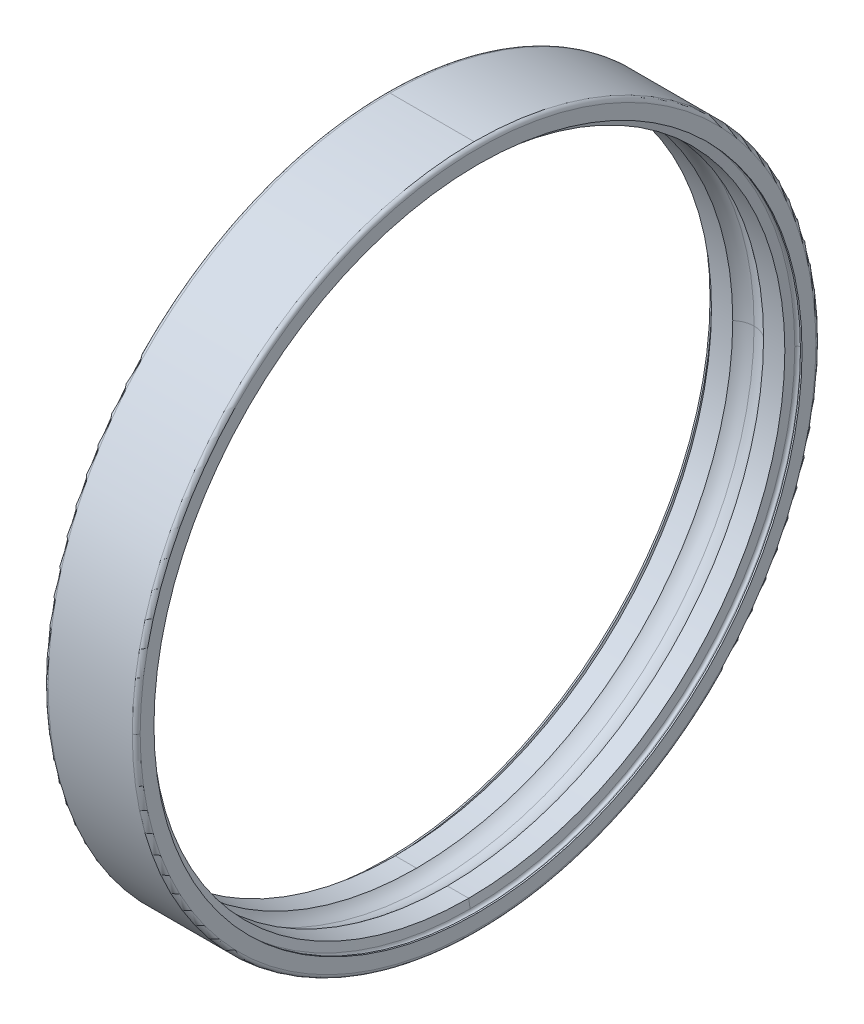
ISO-10303-21;
HEADER;
FILE_DESCRIPTION(('STEP AP214'),'2;1');
FILE_NAME('part.step','',(''),(''),'','','');
FILE_SCHEMA(('AUTOMOTIVE_DESIGN { 1 0 10303 214 1 1 1 1 }'));
ENDSEC;
DATA;
#1=APPLICATION_CONTEXT('core data for automotive mechanical design processes');
#2=APPLICATION_PROTOCOL_DEFINITION('international standard','automotive_design',2000,#1);
#3=PRODUCT_CONTEXT('',#1,'mechanical');
#4=PRODUCT('Part','Part','',(#3));
#5=PRODUCT_RELATED_PRODUCT_CATEGORY('part','',(#4));
#6=PRODUCT_DEFINITION_FORMATION('','',#4);
#7=PRODUCT_DEFINITION_CONTEXT('part definition',#1,'design');
#8=PRODUCT_DEFINITION('design','',#6,#7);
#9=PRODUCT_DEFINITION_SHAPE('','',#8);
#10=(LENGTH_UNIT() NAMED_UNIT(*) SI_UNIT(.MILLI.,.METRE.));
#11=(NAMED_UNIT(*) PLANE_ANGLE_UNIT() SI_UNIT($,.RADIAN.));
#12=(NAMED_UNIT(*) SI_UNIT($,.STERADIAN.) SOLID_ANGLE_UNIT());
#13=UNCERTAINTY_MEASURE_WITH_UNIT(LENGTH_MEASURE(1.E-05),#10,'distance_accuracy_value','');
#14=(GEOMETRIC_REPRESENTATION_CONTEXT(3) GLOBAL_UNCERTAINTY_ASSIGNED_CONTEXT((#13)) GLOBAL_UNIT_ASSIGNED_CONTEXT((#10,
#11,#12)) REPRESENTATION_CONTEXT('',''));
#15=CARTESIAN_POINT('',(0.,0.,0.));
#16=DIRECTION('',(0.,0.,1.));
#17=DIRECTION('',(1.,0.,0.));
#18=AXIS2_PLACEMENT_3D('',#15,#16,#17);
#19=CARTESIAN_POINT('',(6.64,0.,0.));
#20=DIRECTION('',(1.,0.,0.));
#21=DIRECTION('',(0.,0.,-1.));
#22=AXIS2_PLACEMENT_3D('',#19,#20,#21);
#23=TOROIDAL_SURFACE('',#22,24.65,0.24);
#24=CARTESIAN_POINT('',(6.64,0.,0.));
#25=DIRECTION('',(1.,0.,0.));
#26=DIRECTION('',(0.,0.,1.));
#27=AXIS2_PLACEMENT_3D('',#24,#25,#26);
#28=CIRCLE('',#27,24.89);
#29=CARTESIAN_POINT('',(6.64,0.,-24.89));
#30=VERTEX_POINT('',#29);
#31=CARTESIAN_POINT('',(6.64,0.,24.89));
#32=VERTEX_POINT('',#31);
#33=EDGE_CURVE('E421',#30,#32,#28,.T.);
#34=ORIENTED_EDGE('',*,*,#33,.T.);
#35=CARTESIAN_POINT('',(6.64,0.,24.65));
#36=DIRECTION('',(0.,-1.,0.));
#37=DIRECTION('',(0.,0.,1.));
#38=AXIS2_PLACEMENT_3D('',#35,#36,#37);
#39=CIRCLE('',#38,0.24);
#40=CARTESIAN_POINT('',(6.40364613927707,0.,24.6916755626401));
#41=VERTEX_POINT('',#40);
#42=EDGE_CURVE('E267',#32,#41,#39,.T.);
#43=ORIENTED_EDGE('',*,*,#42,.T.);
#44=CARTESIAN_POINT('',(6.40364613927707,0.,0.));
#45=DIRECTION('',(1.,0.,0.));
#46=DIRECTION('',(0.,1.,0.));
#47=AXIS2_PLACEMENT_3D('',#44,#45,#46);
#48=CIRCLE('',#47,24.6916755626401);
#49=CARTESIAN_POINT('',(6.40364613927707,24.6916755626401,0.));
#50=VERTEX_POINT('',#49);
#51=EDGE_CURVE('E32',#50,#41,#48,.T.);
#52=ORIENTED_EDGE('',*,*,#51,.F.);
#53=CARTESIAN_POINT('',(6.40364613927707,0.,0.));
#54=DIRECTION('',(1.,0.,0.));
#55=DIRECTION('',(0.,1.,0.));
#56=AXIS2_PLACEMENT_3D('',#53,#54,#55);
#57=CIRCLE('',#56,24.6916755626401);
#58=CARTESIAN_POINT('',(6.40364613927707,0.,-24.6916755626401));
#59=VERTEX_POINT('',#58);
#60=EDGE_CURVE('E205',#59,#50,#57,.T.);
#61=ORIENTED_EDGE('',*,*,#60,.F.);
#62=CARTESIAN_POINT('',(6.64,0.,-24.65));
#63=DIRECTION('',(0.,-1.,0.));
#64=DIRECTION('',(0.,0.,-1.));
#65=AXIS2_PLACEMENT_3D('',#62,#63,#64);
#66=CIRCLE('',#65,0.24);
#67=EDGE_CURVE('E253',#59,#30,#66,.T.);
#68=ORIENTED_EDGE('',*,*,#67,.T.);
#69=EDGE_LOOP('',(#34,#43,#52,#61,#68));
#70=FACE_BOUND('',#69,.T.);
#71=ADVANCED_FACE('F17',(#70),#23,.F.);
#72=CARTESIAN_POINT('',(6.94,0.,0.));
#73=DIRECTION('',(1.,0.,0.));
#74=DIRECTION('',(0.,1.,0.));
#75=AXIS2_PLACEMENT_3D('',#72,#73,#74);
#76=CYLINDRICAL_SURFACE('',#75,24.65);
#77=DIRECTION('',(1.,0.,0.));
#78=VECTOR('',#77,1.);
#79=CARTESIAN_POINT('',(6.94,24.65,0.));
#80=LINE('',#79,#78);
#81=CARTESIAN_POINT('',(6.88,24.65,0.));
#82=VERTEX_POINT('',#81);
#83=CARTESIAN_POINT('',(7.,24.65,0.));
#84=VERTEX_POINT('',#83);
#85=EDGE_CURVE('E269',#82,#84,#80,.T.);
#86=ORIENTED_EDGE('',*,*,#85,.T.);
#87=CARTESIAN_POINT('',(7.,0.,0.));
#88=DIRECTION('',(1.,0.,0.));
#89=DIRECTION('',(0.,1.,0.));
#90=AXIS2_PLACEMENT_3D('',#87,#88,#89);
#91=CIRCLE('',#90,24.65);
#92=CARTESIAN_POINT('',(7.,-24.65,0.));
#93=VERTEX_POINT('',#92);
#94=EDGE_CURVE('E11',#84,#93,#91,.T.);
#95=ORIENTED_EDGE('',*,*,#94,.T.);
#96=DIRECTION('',(-1.,0.,0.));
#97=VECTOR('',#96,1.);
#98=CARTESIAN_POINT('',(6.94,-24.65,0.));
#99=LINE('',#98,#97);
#100=CARTESIAN_POINT('',(6.88,-24.65,0.));
#101=VERTEX_POINT('',#100);
#102=EDGE_CURVE('E272',#93,#101,#99,.T.);
#103=ORIENTED_EDGE('',*,*,#102,.T.);
#104=CARTESIAN_POINT('',(6.88,0.,0.));
#105=DIRECTION('',(1.,0.,0.));
#106=DIRECTION('',(0.,1.,0.));
#107=AXIS2_PLACEMENT_3D('',#104,#105,#106);
#108=CIRCLE('',#107,24.65);
#109=CARTESIAN_POINT('',(6.88,0.,24.65));
#110=VERTEX_POINT('',#109);
#111=EDGE_CURVE('E242',#110,#101,#108,.T.);
#112=ORIENTED_EDGE('',*,*,#111,.F.);
#113=CARTESIAN_POINT('',(6.88,0.,0.));
#114=DIRECTION('',(1.,0.,0.));
#115=DIRECTION('',(0.,1.,0.));
#116=AXIS2_PLACEMENT_3D('',#113,#114,#115);
#117=CIRCLE('',#116,24.65);
#118=EDGE_CURVE('E387',#82,#110,#117,.T.);
#119=ORIENTED_EDGE('',*,*,#118,.F.);
#120=EDGE_LOOP('',(#86,#95,#103,#112,#119));
#121=FACE_BOUND('',#120,.T.);
#122=ADVANCED_FACE('F411',(#121),#76,.F.);
#123=CARTESIAN_POINT('',(7.,25.175,0.));
#124=DIRECTION('',(1.,0.,0.));
#125=DIRECTION('',(0.,1.,0.));
#126=AXIS2_PLACEMENT_3D('',#123,#124,#125);
#127=PLANE('',#126);
#128=ORIENTED_EDGE('',*,*,#94,.F.);
#129=CARTESIAN_POINT('',(7.,0.,0.));
#130=DIRECTION('',(1.,0.,0.));
#131=DIRECTION('',(0.,1.,0.));
#132=AXIS2_PLACEMENT_3D('',#129,#130,#131);
#133=CIRCLE('',#132,24.65);
#134=EDGE_CURVE('E274',#93,#84,#133,.T.);
#135=ORIENTED_EDGE('',*,*,#134,.F.);
#136=EDGE_LOOP('',(#128,#135));
#137=FACE_BOUND('',#136,.T.);
#138=CARTESIAN_POINT('',(7.,0.,0.));
#139=DIRECTION('',(1.,0.,0.));
#140=DIRECTION('',(0.,1.,0.));
#141=AXIS2_PLACEMENT_3D('',#138,#139,#140);
#142=CIRCLE('',#141,25.7);
#143=CARTESIAN_POINT('',(7.,0.,25.7));
#144=VERTEX_POINT('',#143);
#145=CARTESIAN_POINT('',(7.,0.,-25.7));
#146=VERTEX_POINT('',#145);
#147=EDGE_CURVE('E20',#144,#146,#142,.T.);
#148=ORIENTED_EDGE('',*,*,#147,.T.);
#149=CARTESIAN_POINT('',(7.,0.,0.));
#150=DIRECTION('',(1.,0.,0.));
#151=DIRECTION('',(0.,1.,0.));
#152=AXIS2_PLACEMENT_3D('',#149,#150,#151);
#153=CIRCLE('',#152,25.7);
#154=EDGE_CURVE('E280',#146,#144,#153,.T.);
#155=ORIENTED_EDGE('',*,*,#154,.T.);
#156=EDGE_LOOP('',(#148,#155));
#157=FACE_BOUND('',#156,.T.);
#158=ADVANCED_FACE('F415',(#137,#157),#127,.T.);
#159=CARTESIAN_POINT('',(6.7,0.,0.));
#160=DIRECTION('',(1.,0.,0.));
#161=DIRECTION('',(0.,0.,-1.));
#162=AXIS2_PLACEMENT_3D('',#159,#160,#161);
#163=TOROIDAL_SURFACE('',#162,25.7,0.3);
#164=CARTESIAN_POINT('',(6.7,0.,-25.7));
#165=DIRECTION('',(0.,-1.,0.));
#166=DIRECTION('',(0.,0.,-1.));
#167=AXIS2_PLACEMENT_3D('',#164,#165,#166);
#168=CIRCLE('',#167,0.3);
#169=CARTESIAN_POINT('',(6.7,0.,-26.));
#170=VERTEX_POINT('',#169);
#171=EDGE_CURVE('E277',#170,#146,#168,.T.);
#172=ORIENTED_EDGE('',*,*,#171,.T.);
#173=ORIENTED_EDGE('',*,*,#147,.F.);
#174=CARTESIAN_POINT('',(6.7,0.,25.7));
#175=DIRECTION('',(0.,-1.,0.));
#176=DIRECTION('',(0.,0.,1.));
#177=AXIS2_PLACEMENT_3D('',#174,#175,#176);
#178=CIRCLE('',#177,0.3);
#179=CARTESIAN_POINT('',(6.7,0.,26.));
#180=VERTEX_POINT('',#179);
#181=EDGE_CURVE('E284',#144,#180,#178,.T.);
#182=ORIENTED_EDGE('',*,*,#181,.T.);
#183=CARTESIAN_POINT('',(6.7,0.,0.));
#184=DIRECTION('',(1.,0.,0.));
#185=DIRECTION('',(0.,1.,0.));
#186=AXIS2_PLACEMENT_3D('',#183,#184,#185);
#187=CIRCLE('',#186,26.);
#188=CARTESIAN_POINT('',(6.7,-26.,0.));
#189=VERTEX_POINT('',#188);
#190=EDGE_CURVE('E294',#180,#189,#187,.T.);
#191=ORIENTED_EDGE('',*,*,#190,.T.);
#192=CARTESIAN_POINT('',(6.7,0.,0.));
#193=DIRECTION('',(1.,0.,0.));
#194=DIRECTION('',(0.,1.,0.));
#195=AXIS2_PLACEMENT_3D('',#192,#193,#194);
#196=CIRCLE('',#195,26.);
#197=EDGE_CURVE('E215',#189,#170,#196,.T.);
#198=ORIENTED_EDGE('',*,*,#197,.T.);
#199=EDGE_LOOP('',(#172,#173,#182,#191,#198));
#200=FACE_BOUND('',#199,.T.);
#201=ADVANCED_FACE('F451',(#200),#163,.T.);
#202=CARTESIAN_POINT('',(3.5,0.,0.));
#203=DIRECTION('',(1.,0.,0.));
#204=DIRECTION('',(0.,1.,0.));
#205=AXIS2_PLACEMENT_3D('',#202,#203,#204);
#206=CYLINDRICAL_SURFACE('',#205,26.);
#207=DIRECTION('',(1.,0.,0.));
#208=VECTOR('',#207,1.);
#209=CARTESIAN_POINT('',(3.5,26.,0.));
#210=LINE('',#209,#208);
#211=CARTESIAN_POINT('',(0.3,26.,0.));
#212=VERTEX_POINT('',#211);
#213=CARTESIAN_POINT('',(6.7,26.,0.));
#214=VERTEX_POINT('',#213);
#215=EDGE_CURVE('E283',#212,#214,#210,.T.);
#216=ORIENTED_EDGE('',*,*,#215,.T.);
#217=CARTESIAN_POINT('',(6.7,0.,0.));
#218=DIRECTION('',(1.,0.,0.));
#219=DIRECTION('',(0.,1.,0.));
#220=AXIS2_PLACEMENT_3D('',#217,#218,#219);
#221=CIRCLE('',#220,26.);
#222=EDGE_CURVE('E279',#170,#214,#221,.T.);
#223=ORIENTED_EDGE('',*,*,#222,.F.);
#224=ORIENTED_EDGE('',*,*,#197,.F.);
#225=DIRECTION('',(-1.,0.,0.));
#226=VECTOR('',#225,1.);
#227=CARTESIAN_POINT('',(3.5,-26.,0.));
#228=LINE('',#227,#226);
#229=CARTESIAN_POINT('',(0.3,-26.,0.));
#230=VERTEX_POINT('',#229);
#231=EDGE_CURVE('E292',#189,#230,#228,.T.);
#232=ORIENTED_EDGE('',*,*,#231,.T.);
#233=CARTESIAN_POINT('',(0.3,0.,0.));
#234=DIRECTION('',(1.,0.,0.));
#235=DIRECTION('',(0.,1.,0.));
#236=AXIS2_PLACEMENT_3D('',#233,#234,#235);
#237=CIRCLE('',#236,26.);
#238=CARTESIAN_POINT('',(0.3,0.,-26.));
#239=VERTEX_POINT('',#238);
#240=EDGE_CURVE('E214',#230,#239,#237,.T.);
#241=ORIENTED_EDGE('',*,*,#240,.T.);
#242=CARTESIAN_POINT('',(0.3,0.,0.));
#243=DIRECTION('',(1.,0.,0.));
#244=DIRECTION('',(0.,1.,0.));
#245=AXIS2_PLACEMENT_3D('',#242,#243,#244);
#246=CIRCLE('',#245,26.);
#247=EDGE_CURVE('E306',#239,#212,#246,.T.);
#248=ORIENTED_EDGE('',*,*,#247,.T.);
#249=EDGE_LOOP('',(#216,#223,#224,#232,#241,#248));
#250=FACE_BOUND('',#249,.T.);
#251=ADVANCED_FACE('F462',(#250),#206,.T.);
#252=CARTESIAN_POINT('',(0.3,0.,0.));
#253=DIRECTION('',(1.,0.,0.));
#254=DIRECTION('',(0.,0.,-1.));
#255=AXIS2_PLACEMENT_3D('',#252,#253,#254);
#256=TOROIDAL_SURFACE('',#255,25.7,0.3);
#257=CARTESIAN_POINT('',(0.3,0.,-25.7));
#258=DIRECTION('',(0.,-1.,0.));
#259=DIRECTION('',(0.,0.,-1.));
#260=AXIS2_PLACEMENT_3D('',#257,#258,#259);
#261=CIRCLE('',#260,0.3);
#262=CARTESIAN_POINT('',(0.,0.,-25.7));
#263=VERTEX_POINT('',#262);
#264=EDGE_CURVE('E296',#263,#239,#261,.T.);
#265=ORIENTED_EDGE('',*,*,#264,.T.);
#266=ORIENTED_EDGE('',*,*,#240,.F.);
#267=CARTESIAN_POINT('',(0.3,0.,0.));
#268=DIRECTION('',(1.,0.,0.));
#269=DIRECTION('',(0.,1.,0.));
#270=AXIS2_PLACEMENT_3D('',#267,#268,#269);
#271=CIRCLE('',#270,26.);
#272=CARTESIAN_POINT('',(0.3,0.,26.));
#273=VERTEX_POINT('',#272);
#274=EDGE_CURVE('E289',#273,#230,#271,.T.);
#275=ORIENTED_EDGE('',*,*,#274,.F.);
#276=CARTESIAN_POINT('',(0.3,0.,25.7));
#277=DIRECTION('',(0.,-1.,0.));
#278=DIRECTION('',(0.,0.,1.));
#279=AXIS2_PLACEMENT_3D('',#276,#277,#278);
#280=CIRCLE('',#279,0.3);
#281=CARTESIAN_POINT('',(0.,0.,25.7));
#282=VERTEX_POINT('',#281);
#283=EDGE_CURVE('E303',#273,#282,#280,.T.);
#284=ORIENTED_EDGE('',*,*,#283,.T.);
#285=CARTESIAN_POINT('',(0.,0.,0.));
#286=DIRECTION('',(1.,0.,0.));
#287=DIRECTION('',(0.,1.,0.));
#288=AXIS2_PLACEMENT_3D('',#285,#286,#287);
#289=CIRCLE('',#288,25.7);
#290=EDGE_CURVE('E213',#282,#263,#289,.T.);
#291=ORIENTED_EDGE('',*,*,#290,.T.);
#292=EDGE_LOOP('',(#265,#266,#275,#284,#291));
#293=FACE_BOUND('',#292,.T.);
#294=ADVANCED_FACE('F545',(#293),#256,.T.);
#295=CARTESIAN_POINT('',(0.,25.175,0.));
#296=DIRECTION('',(-1.,0.,0.));
#297=DIRECTION('',(0.,0.,1.));
#298=AXIS2_PLACEMENT_3D('',#295,#296,#297);
#299=PLANE('',#298);
#300=CARTESIAN_POINT('',(0.,0.,0.));
#301=DIRECTION('',(1.,0.,0.));
#302=DIRECTION('',(0.,1.,0.));
#303=AXIS2_PLACEMENT_3D('',#300,#301,#302);
#304=CIRCLE('',#303,24.65);
#305=CARTESIAN_POINT('',(0.,24.65,0.));
#306=VERTEX_POINT('',#305);
#307=CARTESIAN_POINT('',(0.,-24.65,0.));
#308=VERTEX_POINT('',#307);
#309=EDGE_CURVE('E210',#306,#308,#304,.T.);
#310=ORIENTED_EDGE('',*,*,#309,.T.);
#311=CARTESIAN_POINT('',(0.,0.,0.));
#312=DIRECTION('',(1.,0.,0.));
#313=DIRECTION('',(0.,1.,0.));
#314=AXIS2_PLACEMENT_3D('',#311,#312,#313);
#315=CIRCLE('',#314,24.65);
#316=EDGE_CURVE('E311',#308,#306,#315,.T.);
#317=ORIENTED_EDGE('',*,*,#316,.T.);
#318=EDGE_LOOP('',(#310,#317));
#319=FACE_BOUND('',#318,.T.);
#320=CARTESIAN_POINT('',(0.,0.,0.));
#321=DIRECTION('',(1.,0.,0.));
#322=DIRECTION('',(0.,1.,0.));
#323=AXIS2_PLACEMENT_3D('',#320,#321,#322);
#324=CIRCLE('',#323,25.7);
#325=EDGE_CURVE('E299',#263,#282,#324,.T.);
#326=ORIENTED_EDGE('',*,*,#325,.F.);
#327=ORIENTED_EDGE('',*,*,#290,.F.);
#328=EDGE_LOOP('',(#326,#327));
#329=FACE_BOUND('',#328,.T.);
#330=ADVANCED_FACE('F541',(#319,#329),#299,.T.);
#331=CARTESIAN_POINT('',(0.06,0.,0.));
#332=DIRECTION('',(1.,0.,0.));
#333=DIRECTION('',(0.,1.,0.));
#334=AXIS2_PLACEMENT_3D('',#331,#332,#333);
#335=CYLINDRICAL_SURFACE('',#334,24.65);
#336=DIRECTION('',(1.,0.,0.));
#337=VECTOR('',#336,1.);
#338=CARTESIAN_POINT('',(0.06,24.65,0.));
#339=LINE('',#338,#337);
#340=CARTESIAN_POINT('',(0.12,24.65,0.));
#341=VERTEX_POINT('',#340);
#342=EDGE_CURVE('E308',#306,#341,#339,.T.);
#343=ORIENTED_EDGE('',*,*,#342,.T.);
#344=CARTESIAN_POINT('',(0.12,0.,0.));
#345=DIRECTION('',(1.,0.,0.));
#346=DIRECTION('',(0.,1.,0.));
#347=AXIS2_PLACEMENT_3D('',#344,#345,#346);
#348=CIRCLE('',#347,24.65);
#349=CARTESIAN_POINT('',(0.12,0.,24.65));
#350=VERTEX_POINT('',#349);
#351=EDGE_CURVE('E209',#341,#350,#348,.T.);
#352=ORIENTED_EDGE('',*,*,#351,.T.);
#353=CARTESIAN_POINT('',(0.12,0.,0.));
#354=DIRECTION('',(1.,0.,0.));
#355=DIRECTION('',(0.,1.,0.));
#356=AXIS2_PLACEMENT_3D('',#353,#354,#355);
#357=CIRCLE('',#356,24.65);
#358=CARTESIAN_POINT('',(0.12,-24.65,0.));
#359=VERTEX_POINT('',#358);
#360=EDGE_CURVE('E247',#350,#359,#357,.T.);
#361=ORIENTED_EDGE('',*,*,#360,.T.);
#362=DIRECTION('',(-1.,0.,0.));
#363=VECTOR('',#362,1.);
#364=CARTESIAN_POINT('',(0.06,-24.65,0.));
#365=LINE('',#364,#363);
#366=EDGE_CURVE('E314',#359,#308,#365,.T.);
#367=ORIENTED_EDGE('',*,*,#366,.T.);
#368=ORIENTED_EDGE('',*,*,#309,.F.);
#369=EDGE_LOOP('',(#343,#352,#361,#367,#368));
#370=FACE_BOUND('',#369,.T.);
#371=ADVANCED_FACE('F538',(#370),#335,.F.);
#372=CARTESIAN_POINT('',(0.36,0.,0.));
#373=DIRECTION('',(1.,0.,0.));
#374=DIRECTION('',(0.,0.,-1.));
#375=AXIS2_PLACEMENT_3D('',#372,#373,#374);
#376=TOROIDAL_SURFACE('',#375,24.65,0.24);
#377=CARTESIAN_POINT('',(0.36,0.,0.));
#378=DIRECTION('',(1.,0.,0.));
#379=DIRECTION('',(0.,0.,1.));
#380=AXIS2_PLACEMENT_3D('',#377,#378,#379);
#381=CIRCLE('',#380,24.89);
#382=CARTESIAN_POINT('',(0.36,0.,-24.89));
#383=VERTEX_POINT('',#382);
#384=CARTESIAN_POINT('',(0.36,0.,24.89));
#385=VERTEX_POINT('',#384);
#386=EDGE_CURVE('E378',#383,#385,#381,.T.);
#387=ORIENTED_EDGE('',*,*,#386,.T.);
#388=CARTESIAN_POINT('',(0.36,0.,24.65));
#389=DIRECTION('',(0.,-1.,0.));
#390=DIRECTION('',(0.,0.,1.));
#391=AXIS2_PLACEMENT_3D('',#388,#389,#390);
#392=CIRCLE('',#391,0.24);
#393=EDGE_CURVE('E243',#385,#350,#392,.T.);
#394=ORIENTED_EDGE('',*,*,#393,.T.);
#395=ORIENTED_EDGE('',*,*,#351,.F.);
#396=CARTESIAN_POINT('',(0.12,0.,0.));
#397=DIRECTION('',(1.,0.,0.));
#398=DIRECTION('',(0.,1.,0.));
#399=AXIS2_PLACEMENT_3D('',#396,#397,#398);
#400=CIRCLE('',#399,24.65);
#401=CARTESIAN_POINT('',(0.12,0.,-24.65));
#402=VERTEX_POINT('',#401);
#403=EDGE_CURVE('E229',#402,#341,#400,.T.);
#404=ORIENTED_EDGE('',*,*,#403,.F.);
#405=CARTESIAN_POINT('',(0.36,0.,-24.65));
#406=DIRECTION('',(0.,-1.,0.));
#407=DIRECTION('',(0.,0.,-1.));
#408=AXIS2_PLACEMENT_3D('',#405,#406,#407);
#409=CIRCLE('',#408,0.24);
#410=EDGE_CURVE('E232',#402,#383,#409,.T.);
#411=ORIENTED_EDGE('',*,*,#410,.T.);
#412=EDGE_LOOP('',(#387,#394,#395,#404,#411));
#413=FACE_BOUND('',#412,.T.);
#414=ADVANCED_FACE('F535',(#413),#376,.F.);
#415=CARTESIAN_POINT('',(0.652926218000291,0.,0.));
#416=DIRECTION('',(-1.,0.,0.));
#417=DIRECTION('',(0.,1.,0.));
#418=AXIS2_PLACEMENT_3D('',#415,#416,#417);
#419=CONICAL_SURFACE('',#418,24.37083778132,1.39626340159546);
#420=DIRECTION('',(0.173648177666931,-0.984807753012208,0.));
#421=VECTOR('',#420,1.);
#422=CARTESIAN_POINT('',(0.652926218000291,24.37083778132,0.));
#423=LINE('',#422,#421);
#424=CARTESIAN_POINT('',(0.596353860722928,24.6916755626401,0.));
#425=VERTEX_POINT('',#424);
#426=CARTESIAN_POINT('',(0.709498575277654,24.05,0.));
#427=VERTEX_POINT('',#426);
#428=EDGE_CURVE('E246',#425,#427,#423,.T.);
#429=ORIENTED_EDGE('',*,*,#428,.T.);
#430=CARTESIAN_POINT('',(0.709498575277655,0.,0.));
#431=DIRECTION('',(1.,0.,0.));
#432=DIRECTION('',(0.,1.,0.));
#433=AXIS2_PLACEMENT_3D('',#430,#431,#432);
#434=CIRCLE('',#433,24.05);
#435=CARTESIAN_POINT('',(0.709498575277655,-24.05,0.));
#436=VERTEX_POINT('',#435);
#437=EDGE_CURVE('E176',#427,#436,#434,.T.);
#438=ORIENTED_EDGE('',*,*,#437,.T.);
#439=DIRECTION('',(-0.173648177666931,-0.984807753012208,0.));
#440=VECTOR('',#439,1.);
#441=CARTESIAN_POINT('',(0.652926218000291,-24.37083778132,0.));
#442=LINE('',#441,#440);
#443=CARTESIAN_POINT('',(0.596353860722927,-24.6916755626401,0.));
#444=VERTEX_POINT('',#443);
#445=EDGE_CURVE('E254',#436,#444,#442,.T.);
#446=ORIENTED_EDGE('',*,*,#445,.T.);
#447=CARTESIAN_POINT('',(0.596353860722927,0.,0.));
#448=DIRECTION('',(1.,0.,0.));
#449=DIRECTION('',(0.,1.,0.));
#450=AXIS2_PLACEMENT_3D('',#447,#448,#449);
#451=CIRCLE('',#450,24.6916755626401);
#452=CARTESIAN_POINT('',(0.596353860722927,0.,24.6916755626401));
#453=VERTEX_POINT('',#452);
#454=EDGE_CURVE('E234',#453,#444,#451,.T.);
#455=ORIENTED_EDGE('',*,*,#454,.F.);
#456=CARTESIAN_POINT('',(0.596353860722927,0.,0.));
#457=DIRECTION('',(1.,0.,0.));
#458=DIRECTION('',(0.,1.,0.));
#459=AXIS2_PLACEMENT_3D('',#456,#457,#458);
#460=CIRCLE('',#459,24.6916755626401);
#461=EDGE_CURVE('E350',#425,#453,#460,.T.);
#462=ORIENTED_EDGE('',*,*,#461,.F.);
#463=EDGE_LOOP('',(#429,#438,#446,#455,#462));
#464=FACE_BOUND('',#463,.T.);
#465=ADVANCED_FACE('F394',(#464),#419,.F.);
#466=CARTESIAN_POINT('',(1.51898056194585,0.,0.));
#467=DIRECTION('',(1.,0.,0.));
#468=DIRECTION('',(0.,1.,0.));
#469=AXIS2_PLACEMENT_3D('',#466,#467,#468);
#470=CYLINDRICAL_SURFACE('',#469,24.05);
#471=DIRECTION('',(1.,0.,0.));
#472=VECTOR('',#471,1.);
#473=CARTESIAN_POINT('',(1.51898056194585,24.05,0.));
#474=LINE('',#473,#472);
#475=CARTESIAN_POINT('',(2.32846254861404,24.05,0.));
#476=VERTEX_POINT('',#475);
#477=EDGE_CURVE('E172',#427,#476,#474,.T.);
#478=ORIENTED_EDGE('',*,*,#477,.T.);
#479=CARTESIAN_POINT('',(2.32846254861404,0.,0.));
#480=DIRECTION('',(1.,0.,0.));
#481=DIRECTION('',(0.,1.,0.));
#482=AXIS2_PLACEMENT_3D('',#479,#480,#481);
#483=CIRCLE('',#482,24.05);
#484=CARTESIAN_POINT('',(2.32846254861404,0.,24.05));
#485=VERTEX_POINT('',#484);
#486=EDGE_CURVE('E164',#476,#485,#483,.T.);
#487=ORIENTED_EDGE('',*,*,#486,.T.);
#488=CARTESIAN_POINT('',(2.32846254861404,0.,0.));
#489=DIRECTION('',(1.,0.,0.));
#490=DIRECTION('',(0.,1.,0.));
#491=AXIS2_PLACEMENT_3D('',#488,#489,#490);
#492=CIRCLE('',#491,24.05);
#493=CARTESIAN_POINT('',(2.32846254861404,-24.05,0.));
#494=VERTEX_POINT('',#493);
#495=EDGE_CURVE('E169',#485,#494,#492,.T.);
#496=ORIENTED_EDGE('',*,*,#495,.T.);
#497=DIRECTION('',(-1.,0.,0.));
#498=VECTOR('',#497,1.);
#499=CARTESIAN_POINT('',(1.51898056194585,-24.05,0.));
#500=LINE('',#499,#498);
#501=EDGE_CURVE('E320',#494,#436,#500,.T.);
#502=ORIENTED_EDGE('',*,*,#501,.T.);
#503=ORIENTED_EDGE('',*,*,#437,.F.);
#504=EDGE_LOOP('',(#478,#487,#496,#502,#503));
#505=FACE_BOUND('',#504,.T.);
#506=ADVANCED_FACE('F166',(#505),#470,.F.);
#507=CARTESIAN_POINT('',(3.5,0.,0.));
#508=DIRECTION('',(1.,0.,0.));
#509=DIRECTION('',(0.,0.,-1.));
#510=AXIS2_PLACEMENT_3D('',#507,#508,#509);
#511=TOROIDAL_SURFACE('',#510,22.75,1.75);
#512=CARTESIAN_POINT('',(3.5,0.,0.));
#513=DIRECTION('',(1.,0.,0.));
#514=DIRECTION('',(0.,0.,1.));
#515=AXIS2_PLACEMENT_3D('',#512,#513,#514);
#516=CIRCLE('',#515,24.5);
#517=CARTESIAN_POINT('',(3.5,0.,-24.5));
#518=VERTEX_POINT('',#517);
#519=CARTESIAN_POINT('',(3.5,0.,24.5));
#520=VERTEX_POINT('',#519);
#521=EDGE_CURVE('E182',#518,#520,#516,.T.);
#522=ORIENTED_EDGE('',*,*,#521,.T.);
#523=CARTESIAN_POINT('',(3.5,0.,22.75));
#524=DIRECTION('',(0.,-1.,0.));
#525=DIRECTION('',(0.,0.,1.));
#526=AXIS2_PLACEMENT_3D('',#523,#524,#525);
#527=CIRCLE('',#526,1.75);
#528=EDGE_CURVE('E179',#520,#485,#527,.T.);
#529=ORIENTED_EDGE('',*,*,#528,.T.);
#530=ORIENTED_EDGE('',*,*,#486,.F.);
#531=CARTESIAN_POINT('',(2.32846254861404,0.,0.));
#532=DIRECTION('',(1.,0.,0.));
#533=DIRECTION('',(0.,1.,0.));
#534=AXIS2_PLACEMENT_3D('',#531,#532,#533);
#535=CIRCLE('',#534,24.05);
#536=CARTESIAN_POINT('',(2.32846254861404,0.,-24.05));
#537=VERTEX_POINT('',#536);
#538=EDGE_CURVE('E194',#537,#476,#535,.T.);
#539=ORIENTED_EDGE('',*,*,#538,.F.);
#540=CARTESIAN_POINT('',(3.5,0.,-22.75));
#541=DIRECTION('',(0.,-1.,0.));
#542=DIRECTION('',(0.,0.,-1.));
#543=AXIS2_PLACEMENT_3D('',#540,#541,#542);
#544=CIRCLE('',#543,1.75);
#545=EDGE_CURVE('E192',#537,#518,#544,.T.);
#546=ORIENTED_EDGE('',*,*,#545,.T.);
#547=EDGE_LOOP('',(#522,#529,#530,#539,#546));
#548=FACE_BOUND('',#547,.T.);
#549=ADVANCED_FACE('F180',(#548),#511,.F.);
#550=CARTESIAN_POINT('',(5.48101943805415,0.,0.));
#551=DIRECTION('',(1.,0.,0.));
#552=DIRECTION('',(0.,1.,0.));
#553=AXIS2_PLACEMENT_3D('',#550,#551,#552);
#554=CYLINDRICAL_SURFACE('',#553,24.05);
#555=DIRECTION('',(1.,0.,0.));
#556=VECTOR('',#555,1.);
#557=CARTESIAN_POINT('',(5.48101943805415,24.05,0.));
#558=LINE('',#557,#556);
#559=CARTESIAN_POINT('',(4.67153745138596,24.05,0.));
#560=VERTEX_POINT('',#559);
#561=CARTESIAN_POINT('',(6.29050142472235,24.05,0.));
#562=VERTEX_POINT('',#561);
#563=EDGE_CURVE('E186',#560,#562,#558,.T.);
#564=ORIENTED_EDGE('',*,*,#563,.T.);
#565=CARTESIAN_POINT('',(6.29050142472235,0.,0.));
#566=DIRECTION('',(1.,0.,0.));
#567=DIRECTION('',(0.,1.,0.));
#568=AXIS2_PLACEMENT_3D('',#565,#566,#567);
#569=CIRCLE('',#568,24.05);
#570=CARTESIAN_POINT('',(6.29050142472235,-24.05,0.));
#571=VERTEX_POINT('',#570);
#572=EDGE_CURVE('E41',#562,#571,#569,.T.);
#573=ORIENTED_EDGE('',*,*,#572,.T.);
#574=DIRECTION('',(-1.,0.,0.));
#575=VECTOR('',#574,1.);
#576=CARTESIAN_POINT('',(5.48101943805415,-24.05,0.));
#577=LINE('',#576,#575);
#578=CARTESIAN_POINT('',(4.67153745138596,-24.05,0.));
#579=VERTEX_POINT('',#578);
#580=EDGE_CURVE('E199',#571,#579,#577,.T.);
#581=ORIENTED_EDGE('',*,*,#580,.T.);
#582=CARTESIAN_POINT('',(4.67153745138596,0.,0.));
#583=DIRECTION('',(1.,0.,0.));
#584=DIRECTION('',(0.,1.,0.));
#585=AXIS2_PLACEMENT_3D('',#582,#583,#584);
#586=CIRCLE('',#585,24.05);
#587=CARTESIAN_POINT('',(4.67153745138596,0.,24.05));
#588=VERTEX_POINT('',#587);
#589=EDGE_CURVE('E330',#588,#579,#586,.T.);
#590=ORIENTED_EDGE('',*,*,#589,.F.);
#591=CARTESIAN_POINT('',(4.67153745138596,0.,0.));
#592=DIRECTION('',(1.,0.,0.));
#593=DIRECTION('',(0.,1.,0.));
#594=AXIS2_PLACEMENT_3D('',#591,#592,#593);
#595=CIRCLE('',#594,24.05);
#596=EDGE_CURVE('E435',#560,#588,#595,.T.);
#597=ORIENTED_EDGE('',*,*,#596,.F.);
#598=EDGE_LOOP('',(#564,#573,#581,#590,#597));
#599=FACE_BOUND('',#598,.T.);
#600=ADVANCED_FACE('F525',(#599),#554,.F.);
#601=CARTESIAN_POINT('',(6.34707378199971,0.,0.));
#602=DIRECTION('',(1.,0.,0.));
#603=DIRECTION('',(0.,1.,0.));
#604=AXIS2_PLACEMENT_3D('',#601,#602,#603);
#605=CONICAL_SURFACE('',#604,24.37083778132,1.39626340159546);
#606=DIRECTION('',(0.173648177666932,0.984807753012208,0.));
#607=VECTOR('',#606,1.);
#608=CARTESIAN_POINT('',(6.34707378199971,24.37083778132,0.));
#609=LINE('',#608,#607);
#610=EDGE_CURVE('E200',#562,#50,#609,.T.);
#611=ORIENTED_EDGE('',*,*,#610,.T.);
#612=ORIENTED_EDGE('',*,*,#51,.T.);
#613=CARTESIAN_POINT('',(6.40364613927707,0.,0.));
#614=DIRECTION('',(1.,0.,0.));
#615=DIRECTION('',(0.,1.,0.));
#616=AXIS2_PLACEMENT_3D('',#613,#614,#615);
#617=CIRCLE('',#616,24.6916755626401);
#618=CARTESIAN_POINT('',(6.40364613927707,-24.6916755626401,0.));
#619=VERTEX_POINT('',#618);
#620=EDGE_CURVE('E264',#41,#619,#617,.T.);
#621=ORIENTED_EDGE('',*,*,#620,.T.);
#622=DIRECTION('',(-0.173648177666932,0.984807753012208,0.));
#623=VECTOR('',#622,1.);
#624=CARTESIAN_POINT('',(6.34707378199971,-24.37083778132,0.));
#625=LINE('',#624,#623);
#626=EDGE_CURVE('E203',#619,#571,#625,.T.);
#627=ORIENTED_EDGE('',*,*,#626,.T.);
#628=ORIENTED_EDGE('',*,*,#572,.F.);
#629=EDGE_LOOP('',(#611,#612,#621,#627,#628));
#630=FACE_BOUND('',#629,.T.);
#631=ADVANCED_FACE('F521',(#630),#605,.F.);
#632=CARTESIAN_POINT('',(6.34707378199971,0.,0.));
#633=DIRECTION('',(1.,0.,0.));
#634=DIRECTION('',(0.,1.,0.));
#635=AXIS2_PLACEMENT_3D('',#632,#633,#634);
#636=CONICAL_SURFACE('',#635,24.37083778132,1.39626340159546);
#637=ORIENTED_EDGE('',*,*,#610,.F.);
#638=CARTESIAN_POINT('',(6.29050142472235,0.,0.));
#639=DIRECTION('',(1.,0.,0.));
#640=DIRECTION('',(0.,1.,0.));
#641=AXIS2_PLACEMENT_3D('',#638,#639,#640);
#642=CIRCLE('',#641,24.05);
#643=EDGE_CURVE('E204',#571,#562,#642,.T.);
#644=ORIENTED_EDGE('',*,*,#643,.F.);
#645=ORIENTED_EDGE('',*,*,#626,.F.);
#646=CARTESIAN_POINT('',(6.40364613927707,0.,0.));
#647=DIRECTION('',(1.,0.,0.));
#648=DIRECTION('',(0.,1.,0.));
#649=AXIS2_PLACEMENT_3D('',#646,#647,#648);
#650=CIRCLE('',#649,24.6916755626401);
#651=EDGE_CURVE('E259',#619,#59,#650,.T.);
#652=ORIENTED_EDGE('',*,*,#651,.T.);
#653=ORIENTED_EDGE('',*,*,#60,.T.);
#654=EDGE_LOOP('',(#637,#644,#645,#652,#653));
#655=FACE_BOUND('',#654,.T.);
#656=ADVANCED_FACE('F517',(#655),#636,.F.);
#657=CARTESIAN_POINT('',(5.48101943805415,0.,0.));
#658=DIRECTION('',(1.,0.,0.));
#659=DIRECTION('',(0.,1.,0.));
#660=AXIS2_PLACEMENT_3D('',#657,#658,#659);
#661=CYLINDRICAL_SURFACE('',#660,24.05);
#662=ORIENTED_EDGE('',*,*,#563,.F.);
#663=CARTESIAN_POINT('',(4.67153745138596,0.,0.));
#664=DIRECTION('',(1.,0.,0.));
#665=DIRECTION('',(0.,1.,0.));
#666=AXIS2_PLACEMENT_3D('',#663,#664,#665);
#667=CIRCLE('',#666,24.05);
#668=CARTESIAN_POINT('',(4.67153745138596,0.,-24.05));
#669=VERTEX_POINT('',#668);
#670=EDGE_CURVE('E343',#669,#560,#667,.T.);
#671=ORIENTED_EDGE('',*,*,#670,.F.);
#672=CARTESIAN_POINT('',(4.67153745138596,0.,0.));
#673=DIRECTION('',(1.,0.,0.));
#674=DIRECTION('',(0.,1.,0.));
#675=AXIS2_PLACEMENT_3D('',#672,#673,#674);
#676=CIRCLE('',#675,24.05);
#677=EDGE_CURVE('E339',#579,#669,#676,.T.);
#678=ORIENTED_EDGE('',*,*,#677,.F.);
#679=ORIENTED_EDGE('',*,*,#580,.F.);
#680=ORIENTED_EDGE('',*,*,#643,.T.);
#681=EDGE_LOOP('',(#662,#671,#678,#679,#680));
#682=FACE_BOUND('',#681,.T.);
#683=ADVANCED_FACE('F510',(#682),#661,.F.);
#684=CARTESIAN_POINT('',(3.5,0.,0.));
#685=DIRECTION('',(1.,0.,0.));
#686=DIRECTION('',(0.,0.,-1.));
#687=AXIS2_PLACEMENT_3D('',#684,#685,#686);
#688=TOROIDAL_SURFACE('',#687,22.75,1.75);
#689=CARTESIAN_POINT('',(3.5,0.,0.));
#690=DIRECTION('',(1.,0.,0.));
#691=DIRECTION('',(0.,0.,1.));
#692=AXIS2_PLACEMENT_3D('',#689,#690,#691);
#693=CIRCLE('',#692,24.5);
#694=EDGE_CURVE('E325',#520,#518,#693,.T.);
#695=ORIENTED_EDGE('',*,*,#694,.T.);
#696=ORIENTED_EDGE('',*,*,#545,.F.);
#697=CARTESIAN_POINT('',(2.32846254861404,0.,0.));
#698=DIRECTION('',(1.,0.,0.));
#699=DIRECTION('',(0.,1.,0.));
#700=AXIS2_PLACEMENT_3D('',#697,#698,#699);
#701=CIRCLE('',#700,24.05);
#702=EDGE_CURVE('E190',#494,#537,#701,.T.);
#703=ORIENTED_EDGE('',*,*,#702,.F.);
#704=ORIENTED_EDGE('',*,*,#495,.F.);
#705=ORIENTED_EDGE('',*,*,#528,.F.);
#706=EDGE_LOOP('',(#695,#696,#703,#704,#705));
#707=FACE_BOUND('',#706,.T.);
#708=ADVANCED_FACE('F188',(#707),#688,.F.);
#709=CARTESIAN_POINT('',(1.51898056194585,0.,0.));
#710=DIRECTION('',(1.,0.,0.));
#711=DIRECTION('',(0.,1.,0.));
#712=AXIS2_PLACEMENT_3D('',#709,#710,#711);
#713=CYLINDRICAL_SURFACE('',#712,24.05);
#714=ORIENTED_EDGE('',*,*,#477,.F.);
#715=CARTESIAN_POINT('',(0.709498575277655,0.,0.));
#716=DIRECTION('',(1.,0.,0.));
#717=DIRECTION('',(0.,1.,0.));
#718=AXIS2_PLACEMENT_3D('',#715,#716,#717);
#719=CIRCLE('',#718,24.05);
#720=EDGE_CURVE('E256',#436,#427,#719,.T.);
#721=ORIENTED_EDGE('',*,*,#720,.F.);
#722=ORIENTED_EDGE('',*,*,#501,.F.);
#723=ORIENTED_EDGE('',*,*,#702,.T.);
#724=ORIENTED_EDGE('',*,*,#538,.T.);
#725=EDGE_LOOP('',(#714,#721,#722,#723,#724));
#726=FACE_BOUND('',#725,.T.);
#727=ADVANCED_FACE('F323',(#726),#713,.F.);
#728=CARTESIAN_POINT('',(0.652926218000291,0.,0.));
#729=DIRECTION('',(-1.,0.,0.));
#730=DIRECTION('',(0.,1.,0.));
#731=AXIS2_PLACEMENT_3D('',#728,#729,#730);
#732=CONICAL_SURFACE('',#731,24.37083778132,1.39626340159546);
#733=ORIENTED_EDGE('',*,*,#428,.F.);
#734=CARTESIAN_POINT('',(0.596353860722927,0.,0.));
#735=DIRECTION('',(1.,0.,0.));
#736=DIRECTION('',(0.,1.,0.));
#737=AXIS2_PLACEMENT_3D('',#734,#735,#736);
#738=CIRCLE('',#737,24.6916755626401);
#739=CARTESIAN_POINT('',(0.596353860722927,0.,-24.6916755626401));
#740=VERTEX_POINT('',#739);
#741=EDGE_CURVE('E377',#740,#425,#738,.T.);
#742=ORIENTED_EDGE('',*,*,#741,.F.);
#743=CARTESIAN_POINT('',(0.596353860722927,0.,0.));
#744=DIRECTION('',(1.,0.,0.));
#745=DIRECTION('',(0.,1.,0.));
#746=AXIS2_PLACEMENT_3D('',#743,#744,#745);
#747=CIRCLE('',#746,24.6916755626401);
#748=EDGE_CURVE('E237',#444,#740,#747,.T.);
#749=ORIENTED_EDGE('',*,*,#748,.F.);
#750=ORIENTED_EDGE('',*,*,#445,.F.);
#751=ORIENTED_EDGE('',*,*,#720,.T.);
#752=EDGE_LOOP('',(#733,#742,#749,#750,#751));
#753=FACE_BOUND('',#752,.T.);
#754=ADVANCED_FACE('F397',(#753),#732,.F.);
#755=CARTESIAN_POINT('',(0.36,0.,0.));
#756=DIRECTION('',(1.,0.,0.));
#757=DIRECTION('',(0.,0.,-1.));
#758=AXIS2_PLACEMENT_3D('',#755,#756,#757);
#759=TOROIDAL_SURFACE('',#758,24.65,0.24);
#760=CARTESIAN_POINT('',(0.36,0.,0.));
#761=DIRECTION('',(1.,0.,0.));
#762=DIRECTION('',(0.,0.,1.));
#763=AXIS2_PLACEMENT_3D('',#760,#761,#762);
#764=CIRCLE('',#763,24.89);
#765=EDGE_CURVE('E227',#385,#383,#764,.T.);
#766=ORIENTED_EDGE('',*,*,#765,.T.);
#767=ORIENTED_EDGE('',*,*,#410,.F.);
#768=CARTESIAN_POINT('',(0.12,0.,0.));
#769=DIRECTION('',(1.,0.,0.));
#770=DIRECTION('',(0.,1.,0.));
#771=AXIS2_PLACEMENT_3D('',#768,#769,#770);
#772=CIRCLE('',#771,24.65);
#773=EDGE_CURVE('E233',#359,#402,#772,.T.);
#774=ORIENTED_EDGE('',*,*,#773,.F.);
#775=ORIENTED_EDGE('',*,*,#360,.F.);
#776=ORIENTED_EDGE('',*,*,#393,.F.);
#777=EDGE_LOOP('',(#766,#767,#774,#775,#776));
#778=FACE_BOUND('',#777,.T.);
#779=ADVANCED_FACE('F363',(#778),#759,.F.);
#780=CARTESIAN_POINT('',(0.06,0.,0.));
#781=DIRECTION('',(1.,0.,0.));
#782=DIRECTION('',(0.,1.,0.));
#783=AXIS2_PLACEMENT_3D('',#780,#781,#782);
#784=CYLINDRICAL_SURFACE('',#783,24.65);
#785=ORIENTED_EDGE('',*,*,#342,.F.);
#786=ORIENTED_EDGE('',*,*,#316,.F.);
#787=ORIENTED_EDGE('',*,*,#366,.F.);
#788=ORIENTED_EDGE('',*,*,#773,.T.);
#789=ORIENTED_EDGE('',*,*,#403,.T.);
#790=EDGE_LOOP('',(#785,#786,#787,#788,#789));
#791=FACE_BOUND('',#790,.T.);
#792=ADVANCED_FACE('F405',(#791),#784,.F.);
#793=CARTESIAN_POINT('',(0.3,0.,0.));
#794=DIRECTION('',(1.,0.,0.));
#795=DIRECTION('',(0.,0.,-1.));
#796=AXIS2_PLACEMENT_3D('',#793,#794,#795);
#797=TOROIDAL_SURFACE('',#796,25.7,0.3);
#798=ORIENTED_EDGE('',*,*,#264,.F.);
#799=ORIENTED_EDGE('',*,*,#325,.T.);
#800=ORIENTED_EDGE('',*,*,#283,.F.);
#801=CARTESIAN_POINT('',(0.3,0.,0.));
#802=DIRECTION('',(1.,0.,0.));
#803=DIRECTION('',(0.,1.,0.));
#804=AXIS2_PLACEMENT_3D('',#801,#802,#803);
#805=CIRCLE('',#804,26.);
#806=EDGE_CURVE('E286',#212,#273,#805,.T.);
#807=ORIENTED_EDGE('',*,*,#806,.F.);
#808=ORIENTED_EDGE('',*,*,#247,.F.);
#809=EDGE_LOOP('',(#798,#799,#800,#807,#808));
#810=FACE_BOUND('',#809,.T.);
#811=ADVANCED_FACE('F502',(#810),#797,.T.);
#812=CARTESIAN_POINT('',(3.5,0.,0.));
#813=DIRECTION('',(1.,0.,0.));
#814=DIRECTION('',(0.,1.,0.));
#815=AXIS2_PLACEMENT_3D('',#812,#813,#814);
#816=CYLINDRICAL_SURFACE('',#815,26.);
#817=ORIENTED_EDGE('',*,*,#215,.F.);
#818=ORIENTED_EDGE('',*,*,#806,.T.);
#819=ORIENTED_EDGE('',*,*,#274,.T.);
#820=ORIENTED_EDGE('',*,*,#231,.F.);
#821=ORIENTED_EDGE('',*,*,#190,.F.);
#822=CARTESIAN_POINT('',(6.7,0.,0.));
#823=DIRECTION('',(1.,0.,0.));
#824=DIRECTION('',(0.,1.,0.));
#825=AXIS2_PLACEMENT_3D('',#822,#823,#824);
#826=CIRCLE('',#825,26.);
#827=EDGE_CURVE('E441',#214,#180,#826,.T.);
#828=ORIENTED_EDGE('',*,*,#827,.F.);
#829=EDGE_LOOP('',(#817,#818,#819,#820,#821,#828));
#830=FACE_BOUND('',#829,.T.);
#831=ADVANCED_FACE('F460',(#830),#816,.T.);
#832=CARTESIAN_POINT('',(6.7,0.,0.));
#833=DIRECTION('',(1.,0.,0.));
#834=DIRECTION('',(0.,0.,-1.));
#835=AXIS2_PLACEMENT_3D('',#832,#833,#834);
#836=TOROIDAL_SURFACE('',#835,25.7,0.3);
#837=ORIENTED_EDGE('',*,*,#171,.F.);
#838=ORIENTED_EDGE('',*,*,#222,.T.);
#839=ORIENTED_EDGE('',*,*,#827,.T.);
#840=ORIENTED_EDGE('',*,*,#181,.F.);
#841=ORIENTED_EDGE('',*,*,#154,.F.);
#842=EDGE_LOOP('',(#837,#838,#839,#840,#841));
#843=FACE_BOUND('',#842,.T.);
#844=ADVANCED_FACE('F457',(#843),#836,.T.);
#845=CARTESIAN_POINT('',(6.94,0.,0.));
#846=DIRECTION('',(1.,0.,0.));
#847=DIRECTION('',(0.,1.,0.));
#848=AXIS2_PLACEMENT_3D('',#845,#846,#847);
#849=CYLINDRICAL_SURFACE('',#848,24.65);
#850=ORIENTED_EDGE('',*,*,#85,.F.);
#851=CARTESIAN_POINT('',(6.88,0.,0.));
#852=DIRECTION('',(1.,0.,0.));
#853=DIRECTION('',(0.,1.,0.));
#854=AXIS2_PLACEMENT_3D('',#851,#852,#853);
#855=CIRCLE('',#854,24.65);
#856=CARTESIAN_POINT('',(6.88,0.,-24.65));
#857=VERTEX_POINT('',#856);
#858=EDGE_CURVE('E431',#857,#82,#855,.T.);
#859=ORIENTED_EDGE('',*,*,#858,.F.);
#860=CARTESIAN_POINT('',(6.88,0.,0.));
#861=DIRECTION('',(1.,0.,0.));
#862=DIRECTION('',(0.,1.,0.));
#863=AXIS2_PLACEMENT_3D('',#860,#861,#862);
#864=CIRCLE('',#863,24.65);
#865=EDGE_CURVE('E250',#101,#857,#864,.T.);
#866=ORIENTED_EDGE('',*,*,#865,.F.);
#867=ORIENTED_EDGE('',*,*,#102,.F.);
#868=ORIENTED_EDGE('',*,*,#134,.T.);
#869=EDGE_LOOP('',(#850,#859,#866,#867,#868));
#870=FACE_BOUND('',#869,.T.);
#871=ADVANCED_FACE('F475',(#870),#849,.F.);
#872=CARTESIAN_POINT('',(6.64,0.,0.));
#873=DIRECTION('',(1.,0.,0.));
#874=DIRECTION('',(0.,0.,-1.));
#875=AXIS2_PLACEMENT_3D('',#872,#873,#874);
#876=TOROIDAL_SURFACE('',#875,24.65,0.24);
#877=CARTESIAN_POINT('',(6.64,0.,0.));
#878=DIRECTION('',(1.,0.,0.));
#879=DIRECTION('',(0.,0.,1.));
#880=AXIS2_PLACEMENT_3D('',#877,#878,#879);
#881=CIRCLE('',#880,24.89);
#882=EDGE_CURVE('E239',#32,#30,#881,.T.);
#883=ORIENTED_EDGE('',*,*,#882,.T.);
#884=ORIENTED_EDGE('',*,*,#67,.F.);
#885=ORIENTED_EDGE('',*,*,#651,.F.);
#886=ORIENTED_EDGE('',*,*,#620,.F.);
#887=ORIENTED_EDGE('',*,*,#42,.F.);
#888=EDGE_LOOP('',(#883,#884,#885,#886,#887));
#889=FACE_BOUND('',#888,.T.);
#890=ADVANCED_FACE('F486',(#889),#876,.F.);
#891=CARTESIAN_POINT('',(6.64,0.,0.));
#892=DIRECTION('',(1.,0.,0.));
#893=DIRECTION('',(0.,0.,-1.));
#894=AXIS2_PLACEMENT_3D('',#891,#892,#893);
#895=TOROIDAL_SURFACE('',#894,24.65,0.24);
#896=ORIENTED_EDGE('',*,*,#882,.F.);
#897=CARTESIAN_POINT('',(6.64,0.,24.65));
#898=DIRECTION('',(0.,-1.,0.));
#899=DIRECTION('',(0.,0.,1.));
#900=AXIS2_PLACEMENT_3D('',#897,#898,#899);
#901=CIRCLE('',#900,0.24);
#902=EDGE_CURVE('E384',#110,#32,#901,.T.);
#903=ORIENTED_EDGE('',*,*,#902,.F.);
#904=ORIENTED_EDGE('',*,*,#111,.T.);
#905=ORIENTED_EDGE('',*,*,#865,.T.);
#906=CARTESIAN_POINT('',(6.64,0.,-24.65));
#907=DIRECTION('',(0.,-1.,0.));
#908=DIRECTION('',(0.,0.,-1.));
#909=AXIS2_PLACEMENT_3D('',#906,#907,#908);
#910=CIRCLE('',#909,0.24);
#911=EDGE_CURVE('E429',#30,#857,#910,.T.);
#912=ORIENTED_EDGE('',*,*,#911,.F.);
#913=EDGE_LOOP('',(#896,#903,#904,#905,#912));
#914=FACE_BOUND('',#913,.T.);
#915=ADVANCED_FACE('F471',(#914),#895,.F.);
#916=CARTESIAN_POINT('',(0.36,0.,0.));
#917=DIRECTION('',(1.,0.,0.));
#918=DIRECTION('',(0.,0.,-1.));
#919=AXIS2_PLACEMENT_3D('',#916,#917,#918);
#920=TOROIDAL_SURFACE('',#919,24.65,0.24);
#921=ORIENTED_EDGE('',*,*,#765,.F.);
#922=CARTESIAN_POINT('',(0.36,0.,24.65));
#923=DIRECTION('',(0.,-1.,0.));
#924=DIRECTION('',(0.,0.,1.));
#925=AXIS2_PLACEMENT_3D('',#922,#923,#924);
#926=CIRCLE('',#925,0.24);
#927=EDGE_CURVE('E347',#453,#385,#926,.T.);
#928=ORIENTED_EDGE('',*,*,#927,.F.);
#929=ORIENTED_EDGE('',*,*,#454,.T.);
#930=ORIENTED_EDGE('',*,*,#748,.T.);
#931=CARTESIAN_POINT('',(0.36,0.,-24.65));
#932=DIRECTION('',(0.,-1.,0.));
#933=DIRECTION('',(0.,0.,-1.));
#934=AXIS2_PLACEMENT_3D('',#931,#932,#933);
#935=CIRCLE('',#934,0.24);
#936=EDGE_CURVE('E370',#383,#740,#935,.T.);
#937=ORIENTED_EDGE('',*,*,#936,.F.);
#938=EDGE_LOOP('',(#921,#928,#929,#930,#937));
#939=FACE_BOUND('',#938,.T.);
#940=ADVANCED_FACE('F372',(#939),#920,.F.);
#941=CARTESIAN_POINT('',(3.5,0.,0.));
#942=DIRECTION('',(1.,0.,0.));
#943=DIRECTION('',(0.,0.,-1.));
#944=AXIS2_PLACEMENT_3D('',#941,#942,#943);
#945=TOROIDAL_SURFACE('',#944,22.75,1.75);
#946=ORIENTED_EDGE('',*,*,#694,.F.);
#947=CARTESIAN_POINT('',(3.5,0.,22.75));
#948=DIRECTION('',(0.,-1.,0.));
#949=DIRECTION('',(0.,0.,1.));
#950=AXIS2_PLACEMENT_3D('',#947,#948,#949);
#951=CIRCLE('',#950,1.75);
#952=EDGE_CURVE('E331',#588,#520,#951,.T.);
#953=ORIENTED_EDGE('',*,*,#952,.F.);
#954=ORIENTED_EDGE('',*,*,#589,.T.);
#955=ORIENTED_EDGE('',*,*,#677,.T.);
#956=CARTESIAN_POINT('',(3.5,0.,-22.75));
#957=DIRECTION('',(0.,-1.,0.));
#958=DIRECTION('',(0.,0.,-1.));
#959=AXIS2_PLACEMENT_3D('',#956,#957,#958);
#960=CIRCLE('',#959,1.75);
#961=EDGE_CURVE('E335',#518,#669,#960,.T.);
#962=ORIENTED_EDGE('',*,*,#961,.F.);
#963=EDGE_LOOP('',(#946,#953,#954,#955,#962));
#964=FACE_BOUND('',#963,.T.);
#965=ADVANCED_FACE('F336',(#964),#945,.F.);
#966=CARTESIAN_POINT('',(3.5,0.,0.));
#967=DIRECTION('',(1.,0.,0.));
#968=DIRECTION('',(0.,0.,-1.));
#969=AXIS2_PLACEMENT_3D('',#966,#967,#968);
#970=TOROIDAL_SURFACE('',#969,22.75,1.75);
#971=ORIENTED_EDGE('',*,*,#521,.F.);
#972=ORIENTED_EDGE('',*,*,#961,.T.);
#973=ORIENTED_EDGE('',*,*,#670,.T.);
#974=ORIENTED_EDGE('',*,*,#596,.T.);
#975=ORIENTED_EDGE('',*,*,#952,.T.);
#976=EDGE_LOOP('',(#971,#972,#973,#974,#975));
#977=FACE_BOUND('',#976,.T.);
#978=ADVANCED_FACE('F345',(#977),#970,.F.);
#979=CARTESIAN_POINT('',(0.36,0.,0.));
#980=DIRECTION('',(1.,0.,0.));
#981=DIRECTION('',(0.,0.,-1.));
#982=AXIS2_PLACEMENT_3D('',#979,#980,#981);
#983=TOROIDAL_SURFACE('',#982,24.65,0.24);
#984=ORIENTED_EDGE('',*,*,#386,.F.);
#985=ORIENTED_EDGE('',*,*,#936,.T.);
#986=ORIENTED_EDGE('',*,*,#741,.T.);
#987=ORIENTED_EDGE('',*,*,#461,.T.);
#988=ORIENTED_EDGE('',*,*,#927,.T.);
#989=EDGE_LOOP('',(#984,#985,#986,#987,#988));
#990=FACE_BOUND('',#989,.T.);
#991=ADVANCED_FACE('F381',(#990),#983,.F.);
#992=CARTESIAN_POINT('',(6.64,0.,0.));
#993=DIRECTION('',(1.,0.,0.));
#994=DIRECTION('',(0.,0.,-1.));
#995=AXIS2_PLACEMENT_3D('',#992,#993,#994);
#996=TOROIDAL_SURFACE('',#995,24.65,0.24);
#997=ORIENTED_EDGE('',*,*,#33,.F.);
#998=ORIENTED_EDGE('',*,*,#911,.T.);
#999=ORIENTED_EDGE('',*,*,#858,.T.);
#1000=ORIENTED_EDGE('',*,*,#118,.T.);
#1001=ORIENTED_EDGE('',*,*,#902,.T.);
#1002=EDGE_LOOP('',(#997,#998,#999,#1000,#1001));
#1003=FACE_BOUND('',#1002,.T.);
#1004=ADVANCED_FACE('F477',(#1003),#996,.F.);
#1005=CLOSED_SHELL('',(#71,#122,#158,#201,#251,#294,#330,#371,#414,#465,#506,#549,#600,#631,
#656,#683,#708,#727,#754,#779,#792,#811,#831,#844,#871,#890,#915,#940,#965,#978,#991,#1004));
#1006=MANIFOLD_SOLID_BREP('B1',#1005);
#1007=ADVANCED_BREP_SHAPE_REPRESENTATION('',(#18,#1006),#14);
#1008=SHAPE_DEFINITION_REPRESENTATION(#9,#1007);
ENDSEC;
END-ISO-10303-21;
